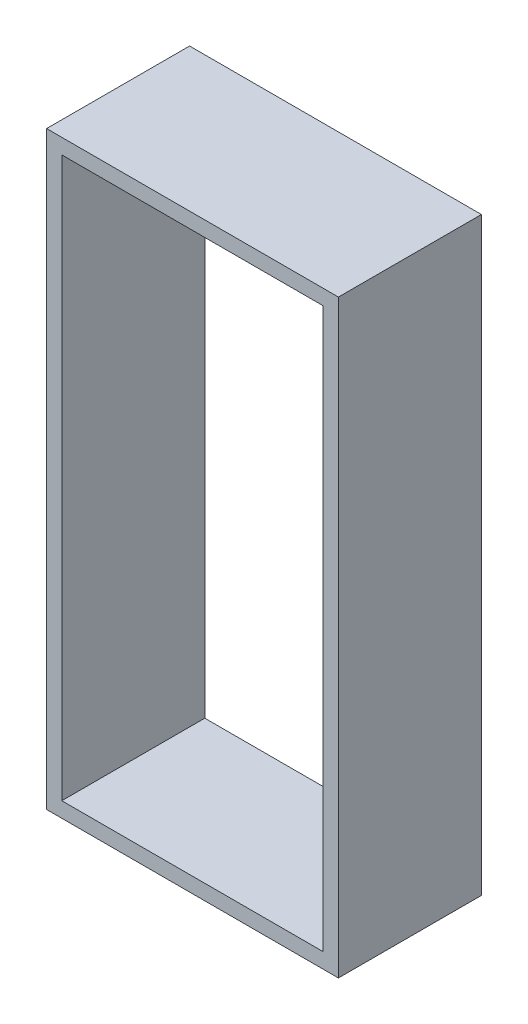
ISO-10303-21;
HEADER;
FILE_DESCRIPTION(('STEP AP214'),'2;1');
FILE_NAME('part.step','',(''),(''),'','','');
FILE_SCHEMA(('AUTOMOTIVE_DESIGN { 1 0 10303 214 1 1 1 1 }'));
ENDSEC;
DATA;
#1=APPLICATION_CONTEXT('core data for automotive mechanical design processes');
#2=APPLICATION_PROTOCOL_DEFINITION('international standard','automotive_design',2000,#1);
#3=PRODUCT_CONTEXT('',#1,'mechanical');
#4=PRODUCT('Part','Part','',(#3));
#5=PRODUCT_RELATED_PRODUCT_CATEGORY('part','',(#4));
#6=PRODUCT_DEFINITION_FORMATION('','',#4);
#7=PRODUCT_DEFINITION_CONTEXT('part definition',#1,'design');
#8=PRODUCT_DEFINITION('design','',#6,#7);
#9=PRODUCT_DEFINITION_SHAPE('','',#8);
#10=(LENGTH_UNIT() NAMED_UNIT(*) SI_UNIT(.MILLI.,.METRE.));
#11=(NAMED_UNIT(*) PLANE_ANGLE_UNIT() SI_UNIT($,.RADIAN.));
#12=(NAMED_UNIT(*) SI_UNIT($,.STERADIAN.) SOLID_ANGLE_UNIT());
#13=UNCERTAINTY_MEASURE_WITH_UNIT(LENGTH_MEASURE(1.E-05),#10,'distance_accuracy_value','');
#14=(GEOMETRIC_REPRESENTATION_CONTEXT(3) GLOBAL_UNCERTAINTY_ASSIGNED_CONTEXT((#13)) GLOBAL_UNIT_ASSIGNED_CONTEXT((#10,
#11,#12)) REPRESENTATION_CONTEXT('',''));
#15=CARTESIAN_POINT('',(0.,0.,0.));
#16=DIRECTION('',(0.,0.,1.));
#17=DIRECTION('',(1.,0.,0.));
#18=AXIS2_PLACEMENT_3D('',#15,#16,#17);
#19=CARTESIAN_POINT('',(0.,0.,29.8704));
#20=DIRECTION('',(0.,0.,-1.));
#21=DIRECTION('',(-1.,0.,0.));
#22=AXIS2_PLACEMENT_3D('',#19,#20,#21);
#23=PLANE('',#22);
#24=DIRECTION('',(0.,-1.,0.));
#25=VECTOR('',#24,1.);
#26=CARTESIAN_POINT('',(-3.175,-3.175,29.8704));
#27=LINE('',#26,#25);
#28=CARTESIAN_POINT('',(-3.175,120.015,29.8704));
#29=VERTEX_POINT('',#28);
#30=CARTESIAN_POINT('',(-3.175,-3.175,29.8704));
#31=VERTEX_POINT('',#30);
#32=EDGE_CURVE('E159',#29,#31,#27,.T.);
#33=ORIENTED_EDGE('',*,*,#32,.T.);
#34=DIRECTION('',(1.,0.,0.));
#35=VECTOR('',#34,1.);
#36=CARTESIAN_POINT('',(-3.175,-3.175,29.8704));
#37=LINE('',#36,#35);
#38=CARTESIAN_POINT('',(57.785,-3.175,29.8704));
#39=VERTEX_POINT('',#38);
#40=EDGE_CURVE('E163',#31,#39,#37,.T.);
#41=ORIENTED_EDGE('',*,*,#40,.T.);
#42=DIRECTION('',(0.,1.,0.));
#43=VECTOR('',#42,1.);
#44=CARTESIAN_POINT('',(57.785,-3.175,29.8704));
#45=LINE('',#44,#43);
#46=CARTESIAN_POINT('',(57.785,120.015,29.8704));
#47=VERTEX_POINT('',#46);
#48=EDGE_CURVE('E167',#39,#47,#45,.T.);
#49=ORIENTED_EDGE('',*,*,#48,.T.);
#50=DIRECTION('',(-1.,0.,0.));
#51=VECTOR('',#50,1.);
#52=CARTESIAN_POINT('',(-3.175,120.015,29.8704));
#53=LINE('',#52,#51);
#54=EDGE_CURVE('E170',#47,#29,#53,.T.);
#55=ORIENTED_EDGE('',*,*,#54,.T.);
#56=EDGE_LOOP('',(#33,#41,#49,#55));
#57=FACE_BOUND('',#56,.T.);
#58=DIRECTION('',(0.,-1.,0.));
#59=VECTOR('',#58,1.);
#60=CARTESIAN_POINT('',(0.,0.,29.8704));
#61=LINE('',#60,#59);
#62=CARTESIAN_POINT('',(0.,116.84,29.8704));
#63=VERTEX_POINT('',#62);
#64=CARTESIAN_POINT('',(0.,0.,29.8704));
#65=VERTEX_POINT('',#64);
#66=EDGE_CURVE('E111',#63,#65,#61,.T.);
#67=ORIENTED_EDGE('',*,*,#66,.F.);
#68=DIRECTION('',(-1.,0.,0.));
#69=VECTOR('',#68,1.);
#70=CARTESIAN_POINT('',(0.,116.84,29.8704));
#71=LINE('',#70,#69);
#72=CARTESIAN_POINT('',(54.61,116.84,29.8704));
#73=VERTEX_POINT('',#72);
#74=EDGE_CURVE('E137',#73,#63,#71,.T.);
#75=ORIENTED_EDGE('',*,*,#74,.F.);
#76=DIRECTION('',(0.,1.,0.));
#77=VECTOR('',#76,1.);
#78=CARTESIAN_POINT('',(54.61,0.,29.8704));
#79=LINE('',#78,#77);
#80=CARTESIAN_POINT('',(54.61,0.,29.8704));
#81=VERTEX_POINT('',#80);
#82=EDGE_CURVE('E133',#81,#73,#79,.T.);
#83=ORIENTED_EDGE('',*,*,#82,.F.);
#84=DIRECTION('',(1.,0.,0.));
#85=VECTOR('',#84,1.);
#86=CARTESIAN_POINT('',(0.,0.,29.8704));
#87=LINE('',#86,#85);
#88=EDGE_CURVE('E120',#65,#81,#87,.T.);
#89=ORIENTED_EDGE('',*,*,#88,.F.);
#90=EDGE_LOOP('',(#67,#75,#83,#89));
#91=FACE_BOUND('',#90,.T.);
#92=ADVANCED_FACE('F45',(#57,#91),#23,.F.);
#93=CARTESIAN_POINT('',(0.,0.,0.));
#94=DIRECTION('',(0.,0.,-1.));
#95=DIRECTION('',(-1.,0.,0.));
#96=AXIS2_PLACEMENT_3D('',#93,#94,#95);
#97=PLANE('',#96);
#98=DIRECTION('',(0.,-1.,0.));
#99=VECTOR('',#98,1.);
#100=CARTESIAN_POINT('',(-3.175,-3.175,0.));
#101=LINE('',#100,#99);
#102=CARTESIAN_POINT('',(-3.175,120.015,0.));
#103=VERTEX_POINT('',#102);
#104=CARTESIAN_POINT('',(-3.175,-3.175,0.));
#105=VERTEX_POINT('',#104);
#106=EDGE_CURVE('E129',#103,#105,#101,.T.);
#107=ORIENTED_EDGE('',*,*,#106,.F.);
#108=DIRECTION('',(-1.,0.,0.));
#109=VECTOR('',#108,1.);
#110=CARTESIAN_POINT('',(-3.175,120.015,0.));
#111=LINE('',#110,#109);
#112=CARTESIAN_POINT('',(57.785,120.015,0.));
#113=VERTEX_POINT('',#112);
#114=EDGE_CURVE('E164',#113,#103,#111,.T.);
#115=ORIENTED_EDGE('',*,*,#114,.F.);
#116=DIRECTION('',(0.,1.,0.));
#117=VECTOR('',#116,1.);
#118=CARTESIAN_POINT('',(57.785,-3.175,0.));
#119=LINE('',#118,#117);
#120=CARTESIAN_POINT('',(57.785,-3.175,0.));
#121=VERTEX_POINT('',#120);
#122=EDGE_CURVE('E180',#121,#113,#119,.T.);
#123=ORIENTED_EDGE('',*,*,#122,.F.);
#124=DIRECTION('',(1.,0.,0.));
#125=VECTOR('',#124,1.);
#126=CARTESIAN_POINT('',(-3.175,-3.175,0.));
#127=LINE('',#126,#125);
#128=EDGE_CURVE('E177',#105,#121,#127,.T.);
#129=ORIENTED_EDGE('',*,*,#128,.F.);
#130=EDGE_LOOP('',(#107,#115,#123,#129));
#131=FACE_BOUND('',#130,.T.);
#132=DIRECTION('',(-1.,0.,0.));
#133=VECTOR('',#132,1.);
#134=CARTESIAN_POINT('',(0.,116.84,0.));
#135=LINE('',#134,#133);
#136=CARTESIAN_POINT('',(54.61,116.84,0.));
#137=VERTEX_POINT('',#136);
#138=CARTESIAN_POINT('',(0.,116.84,0.));
#139=VERTEX_POINT('',#138);
#140=EDGE_CURVE('E121',#137,#139,#135,.T.);
#141=ORIENTED_EDGE('',*,*,#140,.T.);
#142=DIRECTION('',(0.,-1.,0.));
#143=VECTOR('',#142,1.);
#144=CARTESIAN_POINT('',(0.,0.,0.));
#145=LINE('',#144,#143);
#146=CARTESIAN_POINT('',(0.,0.,0.));
#147=VERTEX_POINT('',#146);
#148=EDGE_CURVE('E69',#139,#147,#145,.T.);
#149=ORIENTED_EDGE('',*,*,#148,.T.);
#150=DIRECTION('',(1.,0.,0.));
#151=VECTOR('',#150,1.);
#152=CARTESIAN_POINT('',(0.,0.,0.));
#153=LINE('',#152,#151);
#154=CARTESIAN_POINT('',(54.61,0.,0.));
#155=VERTEX_POINT('',#154);
#156=EDGE_CURVE('E127',#147,#155,#153,.T.);
#157=ORIENTED_EDGE('',*,*,#156,.T.);
#158=DIRECTION('',(0.,1.,0.));
#159=VECTOR('',#158,1.);
#160=CARTESIAN_POINT('',(54.61,0.,0.));
#161=LINE('',#160,#159);
#162=EDGE_CURVE('E146',#155,#137,#161,.T.);
#163=ORIENTED_EDGE('',*,*,#162,.T.);
#164=EDGE_LOOP('',(#141,#149,#157,#163));
#165=FACE_BOUND('',#164,.T.);
#166=ADVANCED_FACE('F203',(#131,#165),#97,.T.);
#167=CARTESIAN_POINT('',(-3.175,-3.175,29.8704));
#168=DIRECTION('',(1.,0.,0.));
#169=DIRECTION('',(0.,0.,-1.));
#170=AXIS2_PLACEMENT_3D('',#167,#168,#169);
#171=PLANE('',#170);
#172=ORIENTED_EDGE('',*,*,#106,.T.);
#173=DIRECTION('',(0.,0.,-1.));
#174=VECTOR('',#173,1.);
#175=CARTESIAN_POINT('',(-3.175,-3.175,29.8704));
#176=LINE('',#175,#174);
#177=EDGE_CURVE('E11',#31,#105,#176,.T.);
#178=ORIENTED_EDGE('',*,*,#177,.F.);
#179=ORIENTED_EDGE('',*,*,#32,.F.);
#180=DIRECTION('',(0.,0.,-1.));
#181=VECTOR('',#180,1.);
#182=CARTESIAN_POINT('',(-3.175,120.015,29.8704));
#183=LINE('',#182,#181);
#184=EDGE_CURVE('E173',#29,#103,#183,.T.);
#185=ORIENTED_EDGE('',*,*,#184,.T.);
#186=EDGE_LOOP('',(#172,#178,#179,#185));
#187=FACE_BOUND('',#186,.T.);
#188=ADVANCED_FACE('F47',(#187),#171,.F.);
#189=CARTESIAN_POINT('',(-3.175,-3.175,29.8704));
#190=DIRECTION('',(0.,1.,0.));
#191=DIRECTION('',(0.,0.,1.));
#192=AXIS2_PLACEMENT_3D('',#189,#190,#191);
#193=PLANE('',#192);
#194=ORIENTED_EDGE('',*,*,#128,.T.);
#195=DIRECTION('',(0.,0.,-1.));
#196=VECTOR('',#195,1.);
#197=CARTESIAN_POINT('',(57.785,-3.175,29.8704));
#198=LINE('',#197,#196);
#199=EDGE_CURVE('E54',#39,#121,#198,.T.);
#200=ORIENTED_EDGE('',*,*,#199,.F.);
#201=ORIENTED_EDGE('',*,*,#40,.F.);
#202=ORIENTED_EDGE('',*,*,#177,.T.);
#203=EDGE_LOOP('',(#194,#200,#201,#202));
#204=FACE_BOUND('',#203,.T.);
#205=ADVANCED_FACE('F213',(#204),#193,.F.);
#206=CARTESIAN_POINT('',(57.785,-3.175,29.8704));
#207=DIRECTION('',(-1.,0.,0.));
#208=DIRECTION('',(0.,0.,1.));
#209=AXIS2_PLACEMENT_3D('',#206,#207,#208);
#210=PLANE('',#209);
#211=ORIENTED_EDGE('',*,*,#122,.T.);
#212=DIRECTION('',(0.,0.,-1.));
#213=VECTOR('',#212,1.);
#214=CARTESIAN_POINT('',(57.785,120.015,29.8704));
#215=LINE('',#214,#213);
#216=EDGE_CURVE('E188',#47,#113,#215,.T.);
#217=ORIENTED_EDGE('',*,*,#216,.F.);
#218=ORIENTED_EDGE('',*,*,#48,.F.);
#219=ORIENTED_EDGE('',*,*,#199,.T.);
#220=EDGE_LOOP('',(#211,#217,#218,#219));
#221=FACE_BOUND('',#220,.T.);
#222=ADVANCED_FACE('F197',(#221),#210,.F.);
#223=CARTESIAN_POINT('',(-3.175,120.015,29.8704));
#224=DIRECTION('',(0.,-1.,0.));
#225=DIRECTION('',(0.,0.,-1.));
#226=AXIS2_PLACEMENT_3D('',#223,#224,#225);
#227=PLANE('',#226);
#228=ORIENTED_EDGE('',*,*,#114,.T.);
#229=ORIENTED_EDGE('',*,*,#184,.F.);
#230=ORIENTED_EDGE('',*,*,#54,.F.);
#231=ORIENTED_EDGE('',*,*,#216,.T.);
#232=EDGE_LOOP('',(#228,#229,#230,#231));
#233=FACE_BOUND('',#232,.T.);
#234=ADVANCED_FACE('F207',(#233),#227,.F.);
#235=CARTESIAN_POINT('',(0.,0.,29.8704));
#236=DIRECTION('',(1.,0.,0.));
#237=DIRECTION('',(0.,1.,0.));
#238=AXIS2_PLACEMENT_3D('',#235,#236,#237);
#239=PLANE('',#238);
#240=ORIENTED_EDGE('',*,*,#148,.F.);
#241=DIRECTION('',(0.,0.,-1.));
#242=VECTOR('',#241,1.);
#243=CARTESIAN_POINT('',(0.,116.84,29.8704));
#244=LINE('',#243,#242);
#245=EDGE_CURVE('E115',#63,#139,#244,.T.);
#246=ORIENTED_EDGE('',*,*,#245,.F.);
#247=ORIENTED_EDGE('',*,*,#66,.T.);
#248=DIRECTION('',(0.,0.,-1.));
#249=VECTOR('',#248,1.);
#250=CARTESIAN_POINT('',(0.,0.,29.8704));
#251=LINE('',#250,#249);
#252=EDGE_CURVE('E114',#65,#147,#251,.T.);
#253=ORIENTED_EDGE('',*,*,#252,.T.);
#254=EDGE_LOOP('',(#240,#246,#247,#253));
#255=FACE_BOUND('',#254,.T.);
#256=ADVANCED_FACE('F113',(#255),#239,.T.);
#257=CARTESIAN_POINT('',(0.,0.,29.8704));
#258=DIRECTION('',(0.,1.,0.));
#259=DIRECTION('',(0.,0.,1.));
#260=AXIS2_PLACEMENT_3D('',#257,#258,#259);
#261=PLANE('',#260);
#262=ORIENTED_EDGE('',*,*,#156,.F.);
#263=ORIENTED_EDGE('',*,*,#252,.F.);
#264=ORIENTED_EDGE('',*,*,#88,.T.);
#265=DIRECTION('',(0.,0.,-1.));
#266=VECTOR('',#265,1.);
#267=CARTESIAN_POINT('',(54.61,0.,29.8704));
#268=LINE('',#267,#266);
#269=EDGE_CURVE('E130',#81,#155,#268,.T.);
#270=ORIENTED_EDGE('',*,*,#269,.T.);
#271=EDGE_LOOP('',(#262,#263,#264,#270));
#272=FACE_BOUND('',#271,.T.);
#273=ADVANCED_FACE('F124',(#272),#261,.T.);
#274=CARTESIAN_POINT('',(54.61,0.,29.8704));
#275=DIRECTION('',(-1.,0.,0.));
#276=DIRECTION('',(0.,-1.,0.));
#277=AXIS2_PLACEMENT_3D('',#274,#275,#276);
#278=PLANE('',#277);
#279=ORIENTED_EDGE('',*,*,#162,.F.);
#280=ORIENTED_EDGE('',*,*,#269,.F.);
#281=ORIENTED_EDGE('',*,*,#82,.T.);
#282=DIRECTION('',(0.,0.,-1.));
#283=VECTOR('',#282,1.);
#284=CARTESIAN_POINT('',(54.61,116.84,29.8704));
#285=LINE('',#284,#283);
#286=EDGE_CURVE('E61',#73,#137,#285,.T.);
#287=ORIENTED_EDGE('',*,*,#286,.T.);
#288=EDGE_LOOP('',(#279,#280,#281,#287));
#289=FACE_BOUND('',#288,.T.);
#290=ADVANCED_FACE('F236',(#289),#278,.T.);
#291=CARTESIAN_POINT('',(0.,116.84,29.8704));
#292=DIRECTION('',(0.,-1.,0.));
#293=DIRECTION('',(0.,0.,-1.));
#294=AXIS2_PLACEMENT_3D('',#291,#292,#293);
#295=PLANE('',#294);
#296=ORIENTED_EDGE('',*,*,#140,.F.);
#297=ORIENTED_EDGE('',*,*,#286,.F.);
#298=ORIENTED_EDGE('',*,*,#74,.T.);
#299=ORIENTED_EDGE('',*,*,#245,.T.);
#300=EDGE_LOOP('',(#296,#297,#298,#299));
#301=FACE_BOUND('',#300,.T.);
#302=ADVANCED_FACE('F240',(#301),#295,.T.);
#303=CLOSED_SHELL('',(#92,#166,#188,#205,#222,#234,#256,#273,#290,#302));
#304=MANIFOLD_SOLID_BREP('B2',#303);
#305=ADVANCED_BREP_SHAPE_REPRESENTATION('',(#18,#304),#14);
#306=SHAPE_DEFINITION_REPRESENTATION(#9,#305);
ENDSEC;
END-ISO-10303-21;
